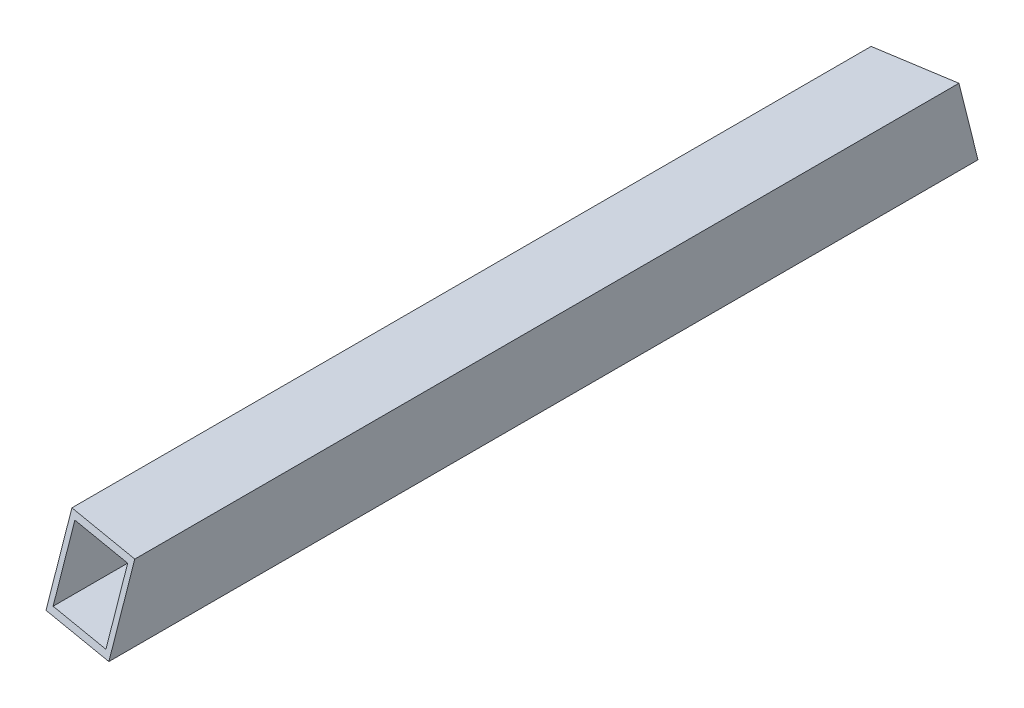
ISO-10303-21;
HEADER;
FILE_DESCRIPTION(('STEP AP214'),'2;1');
FILE_NAME('part.step','',(''),(''),'','','');
FILE_SCHEMA(('AUTOMOTIVE_DESIGN { 1 0 10303 214 1 1 1 1 }'));
ENDSEC;
DATA;
#1=APPLICATION_CONTEXT('core data for automotive mechanical design processes');
#2=APPLICATION_PROTOCOL_DEFINITION('international standard','automotive_design',2000,#1);
#3=PRODUCT_CONTEXT('',#1,'mechanical');
#4=PRODUCT('Part','Part','',(#3));
#5=PRODUCT_RELATED_PRODUCT_CATEGORY('part','',(#4));
#6=PRODUCT_DEFINITION_FORMATION('','',#4);
#7=PRODUCT_DEFINITION_CONTEXT('part definition',#1,'design');
#8=PRODUCT_DEFINITION('design','',#6,#7);
#9=PRODUCT_DEFINITION_SHAPE('','',#8);
#10=(LENGTH_UNIT() NAMED_UNIT(*) SI_UNIT(.MILLI.,.METRE.));
#11=(NAMED_UNIT(*) PLANE_ANGLE_UNIT() SI_UNIT($,.RADIAN.));
#12=(NAMED_UNIT(*) SI_UNIT($,.STERADIAN.) SOLID_ANGLE_UNIT());
#13=UNCERTAINTY_MEASURE_WITH_UNIT(LENGTH_MEASURE(1.E-05),#10,'distance_accuracy_value','');
#14=(GEOMETRIC_REPRESENTATION_CONTEXT(3) GLOBAL_UNCERTAINTY_ASSIGNED_CONTEXT((#13)) GLOBAL_UNIT_ASSIGNED_CONTEXT((#10,
#11,#12)) REPRESENTATION_CONTEXT('',''));
#15=CARTESIAN_POINT('',(0.,0.,0.));
#16=DIRECTION('',(0.,0.,1.));
#17=DIRECTION('',(1.,0.,0.));
#18=AXIS2_PLACEMENT_3D('',#15,#16,#17);
#19=CARTESIAN_POINT('',(-100.,-90.0000000000004,-550.));
#20=DIRECTION('',(0.,1.,0.));
#21=DIRECTION('',(0.,0.,1.));
#22=AXIS2_PLACEMENT_3D('',#19,#20,#21);
#23=PLANE('',#22);
#24=DIRECTION('',(-0.987732357643365,0.,0.156156298829987));
#25=VECTOR('',#24,1.);
#26=CARTESIAN_POINT('',(-134.564726157136,-90.0000000000004,-768.631580757786));
#27=LINE('',#26,#25);
#28=CARTESIAN_POINT('',(-100.,-90.0000000000004,-774.096117446295));
#29=VERTEX_POINT('',#28);
#30=CARTESIAN_POINT('',(-120.,-90.0000000000004,-770.934202224594));
#31=VERTEX_POINT('',#30);
#32=EDGE_CURVE('E118',#29,#31,#27,.T.);
#33=ORIENTED_EDGE('',*,*,#32,.F.);
#34=DIRECTION('',(0.,0.,-1.));
#35=VECTOR('',#34,1.);
#36=CARTESIAN_POINT('',(-100.,-90.0000000000004,-550.));
#37=LINE('',#36,#35);
#38=CARTESIAN_POINT('',(-100.,-90.0000000000004,-544.875388202502));
#39=VERTEX_POINT('',#38);
#40=EDGE_CURVE('E55',#39,#29,#37,.T.);
#41=ORIENTED_EDGE('',*,*,#40,.F.);
#42=DIRECTION('',(0.985721919281302,0.,0.168381405886715));
#43=VECTOR('',#42,1.);
#44=CARTESIAN_POINT('',(-100.850568935452,-90.0000000000004,-545.020682722542));
#45=LINE('',#44,#43);
#46=CARTESIAN_POINT('',(-120.,-90.0000000000005,-548.291796067501));
#47=VERTEX_POINT('',#46);
#48=EDGE_CURVE('E130',#47,#39,#45,.T.);
#49=ORIENTED_EDGE('',*,*,#48,.F.);
#50=DIRECTION('',(0.,0.,-1.));
#51=VECTOR('',#50,1.);
#52=CARTESIAN_POINT('',(-120.,-90.0000000000004,-550.));
#53=LINE('',#52,#51);
#54=EDGE_CURVE('E137',#47,#31,#53,.T.);
#55=ORIENTED_EDGE('',*,*,#54,.T.);
#56=EDGE_LOOP('',(#33,#41,#49,#55));
#57=FACE_BOUND('',#56,.T.);
#58=ADVANCED_FACE('F41',(#57),#23,.F.);
#59=CARTESIAN_POINT('',(-100.,-90.0000000000004,-550.));
#60=DIRECTION('',(-1.,0.,0.));
#61=DIRECTION('',(0.,0.,1.));
#62=AXIS2_PLACEMENT_3D('',#59,#60,#61);
#63=PLANE('',#62);
#64=DIRECTION('',(0.,-0.969795585317005,-0.243919090478065));
#65=VECTOR('',#64,1.);
#66=CARTESIAN_POINT('',(-100.,-36.9896920638836,-760.763177707749));
#67=LINE('',#66,#65);
#68=CARTESIAN_POINT('',(-100.,-70.0000000000004,-769.065797775406));
#69=VERTEX_POINT('',#68);
#70=EDGE_CURVE('E160',#69,#29,#67,.T.);
#71=ORIENTED_EDGE('',*,*,#70,.F.);
#72=DIRECTION('',(0.,0.,-1.));
#73=VECTOR('',#72,1.);
#74=CARTESIAN_POINT('',(-100.,-70.0000000000004,-550.));
#75=LINE('',#74,#73);
#76=CARTESIAN_POINT('',(-100.,-70.0000000000004,-551.708203932499));
#77=VERTEX_POINT('',#76);
#78=EDGE_CURVE('E127',#77,#69,#75,.T.);
#79=ORIENTED_EDGE('',*,*,#78,.F.);
#80=DIRECTION('',(0.,0.94629851540018,-0.32329416906498));
#81=VECTOR('',#80,1.);
#82=CARTESIAN_POINT('',(-100.,-88.4322132037293,-545.411008116644));
#83=LINE('',#82,#81);
#84=EDGE_CURVE('E175',#39,#77,#83,.T.);
#85=ORIENTED_EDGE('',*,*,#84,.F.);
#86=ORIENTED_EDGE('',*,*,#40,.T.);
#87=EDGE_LOOP('',(#71,#79,#85,#86));
#88=FACE_BOUND('',#87,.T.);
#89=ADVANCED_FACE('F183',(#88),#63,.F.);
#90=CARTESIAN_POINT('',(-100.,-70.0000000000004,-550.));
#91=DIRECTION('',(0.,-1.,0.));
#92=DIRECTION('',(0.,0.,-1.));
#93=AXIS2_PLACEMENT_3D('',#90,#91,#92);
#94=PLANE('',#93);
#95=DIRECTION('',(0.987732357643365,0.,-0.156156298829987));
#96=VECTOR('',#95,1.);
#97=CARTESIAN_POINT('',(-133.788846486,-70.0000000000004,-763.723924374015));
#98=LINE('',#97,#96);
#99=CARTESIAN_POINT('',(-120.,-70.0000000000004,-765.903882553705));
#100=VERTEX_POINT('',#99);
#101=EDGE_CURVE('E163',#100,#69,#98,.T.);
#102=ORIENTED_EDGE('',*,*,#101,.F.);
#103=DIRECTION('',(0.,0.,-1.));
#104=VECTOR('',#103,1.);
#105=CARTESIAN_POINT('',(-120.,-70.0000000000004,-550.));
#106=LINE('',#105,#104);
#107=CARTESIAN_POINT('',(-120.,-70.0000000000004,-555.124611797498));
#108=VERTEX_POINT('',#107);
#109=EDGE_CURVE('E139',#108,#100,#106,.T.);
#110=ORIENTED_EDGE('',*,*,#109,.F.);
#111=DIRECTION('',(-0.985721919281302,0.,-0.168381405886715));
#112=VECTOR('',#111,1.);
#113=CARTESIAN_POINT('',(-99.7164770215165,-70.0000000000004,-551.659772425819));
#114=LINE('',#113,#112);
#115=EDGE_CURVE('E173',#77,#108,#114,.T.);
#116=ORIENTED_EDGE('',*,*,#115,.F.);
#117=ORIENTED_EDGE('',*,*,#78,.T.);
#118=EDGE_LOOP('',(#102,#110,#116,#117));
#119=FACE_BOUND('',#118,.T.);
#120=ADVANCED_FACE('F185',(#119),#94,.F.);
#121=CARTESIAN_POINT('',(-120.,-90.0000000000004,-550.));
#122=DIRECTION('',(1.,0.,0.));
#123=DIRECTION('',(0.,0.,-1.));
#124=AXIS2_PLACEMENT_3D('',#121,#122,#123);
#125=PLANE('',#124);
#126=DIRECTION('',(0.,0.969795585317005,0.243919090478065));
#127=VECTOR('',#126,1.);
#128=CARTESIAN_POINT('',(-120.,-37.7376483492506,-757.78938544681));
#129=LINE('',#128,#127);
#130=EDGE_CURVE('E152',#31,#100,#129,.T.);
#131=ORIENTED_EDGE('',*,*,#130,.F.);
#132=ORIENTED_EDGE('',*,*,#54,.F.);
#133=DIRECTION('',(0.,-0.94629851540018,0.32329416906498));
#134=VECTOR('',#133,1.);
#135=CARTESIAN_POINT('',(-120.,-89.4774044012435,-548.470336038881));
#136=LINE('',#135,#134);
#137=EDGE_CURVE('E170',#108,#47,#136,.T.);
#138=ORIENTED_EDGE('',*,*,#137,.F.);
#139=ORIENTED_EDGE('',*,*,#109,.T.);
#140=EDGE_LOOP('',(#131,#132,#138,#139));
#141=FACE_BOUND('',#140,.T.);
#142=ADVANCED_FACE('F187',(#141),#125,.F.);
#143=CARTESIAN_POINT('',(-110.,-80.,-550.));
#144=DIRECTION('',(-0.159575689721233,0.319151379442465,0.934172358962715));
#145=DIRECTION('',(0.,-0.94629851540018,0.32329416906498));
#146=AXIS2_PLACEMENT_3D('',#143,#144,#145);
#147=PLANE('',#146);
#148=DIRECTION('',(0.,-0.94629851540018,0.32329416906498));
#149=VECTOR('',#148,1.);
#150=CARTESIAN_POINT('',(-118.4,-87.9610196970446,-548.71508227266));
#151=LINE('',#150,#149);
#152=CARTESIAN_POINT('',(-118.4,-71.6000000000004,-554.304673909898));
#153=VERTEX_POINT('',#152);
#154=CARTESIAN_POINT('',(-118.4,-88.4000000000004,-548.5651086967));
#155=VERTEX_POINT('',#154);
#156=EDGE_CURVE('E123',#153,#155,#151,.T.);
#157=ORIENTED_EDGE('',*,*,#156,.F.);
#158=DIRECTION('',(-0.985721919281302,0.,-0.168381405886715));
#159=VECTOR('',#158,1.);
#160=CARTESIAN_POINT('',(-101.361840698074,-71.6000000000004,-551.394208837688));
#161=LINE('',#160,#159);
#162=CARTESIAN_POINT('',(-101.6,-71.6000000000004,-551.434891303299));
#163=VERTEX_POINT('',#162);
#164=EDGE_CURVE('E149',#163,#153,#161,.T.);
#165=ORIENTED_EDGE('',*,*,#164,.F.);
#166=DIRECTION('',(0.,0.94629851540018,-0.32329416906498));
#167=VECTOR('',#166,1.);
#168=CARTESIAN_POINT('',(-101.6,-87.0830590911327,-546.145246817981));
#169=LINE('',#168,#167);
#170=CARTESIAN_POINT('',(-101.6,-88.4000000000004,-545.695326090102));
#171=VERTEX_POINT('',#170);
#172=EDGE_CURVE('E147',#171,#163,#169,.T.);
#173=ORIENTED_EDGE('',*,*,#172,.F.);
#174=DIRECTION('',(0.985721919281302,0.,0.168381405886714));
#175=VECTOR('',#174,1.);
#176=CARTESIAN_POINT('',(-102.31447790578,-88.4000000000004,-545.817373486935));
#177=LINE('',#176,#175);
#178=EDGE_CURVE('E48',#155,#171,#177,.T.);
#179=ORIENTED_EDGE('',*,*,#178,.F.);
#180=EDGE_LOOP('',(#157,#165,#173,#179));
#181=FACE_BOUND('',#180,.T.);
#182=ORIENTED_EDGE('',*,*,#137,.T.);
#183=ORIENTED_EDGE('',*,*,#48,.T.);
#184=ORIENTED_EDGE('',*,*,#84,.T.);
#185=ORIENTED_EDGE('',*,*,#115,.T.);
#186=EDGE_LOOP('',(#182,#183,#184,#185));
#187=FACE_BOUND('',#186,.T.);
#188=ADVANCED_FACE('F144',(#181,#187),#147,.T.);
#189=CARTESIAN_POINT('',(-118.4,-88.4000000000004,-550.));
#190=DIRECTION('',(1.,0.,0.));
#191=DIRECTION('',(0.,0.,-1.));
#192=AXIS2_PLACEMENT_3D('',#189,#190,#191);
#193=PLANE('',#192);
#194=DIRECTION('',(0.,0.,-1.));
#195=VECTOR('',#194,1.);
#196=CARTESIAN_POINT('',(-118.4,-88.4000000000004,-550.));
#197=LINE('',#196,#195);
#198=CARTESIAN_POINT('',(-118.4,-88.4000000000004,-770.784729868659));
#199=VERTEX_POINT('',#198);
#200=EDGE_CURVE('E114',#155,#199,#197,.T.);
#201=ORIENTED_EDGE('',*,*,#200,.T.);
#202=DIRECTION('',(0.,0.969795585317005,0.243919090478065));
#203=VECTOR('',#202,1.);
#204=CARTESIAN_POINT('',(-118.4,-36.1730062827407,-757.648806176293));
#205=LINE('',#204,#203);
#206=CARTESIAN_POINT('',(-118.4,-71.6000000000004,-766.559261345112));
#207=VERTEX_POINT('',#206);
#208=EDGE_CURVE('E11',#199,#207,#205,.T.);
#209=ORIENTED_EDGE('',*,*,#208,.T.);
#210=DIRECTION('',(0.,0.,-1.));
#211=VECTOR('',#210,1.);
#212=CARTESIAN_POINT('',(-118.4,-71.6000000000004,-550.));
#213=LINE('',#212,#211);
#214=EDGE_CURVE('E135',#153,#207,#213,.T.);
#215=ORIENTED_EDGE('',*,*,#214,.F.);
#216=ORIENTED_EDGE('',*,*,#156,.T.);
#217=EDGE_LOOP('',(#201,#209,#215,#216));
#218=FACE_BOUND('',#217,.T.);
#219=ADVANCED_FACE('F122',(#218),#193,.T.);
#220=CARTESIAN_POINT('',(-101.6,-71.6000000000004,-550.));
#221=DIRECTION('',(0.,-1.,0.));
#222=DIRECTION('',(0.,0.,-1.));
#223=AXIS2_PLACEMENT_3D('',#220,#221,#222);
#224=PLANE('',#223);
#225=ORIENTED_EDGE('',*,*,#214,.T.);
#226=DIRECTION('',(0.987732357643365,0.,-0.156156298829987));
#227=VECTOR('',#226,1.);
#228=CARTESIAN_POINT('',(-135.411901196228,-71.6000000000004,-763.86975187799));
#229=LINE('',#228,#227);
#230=CARTESIAN_POINT('',(-101.6,-71.6000000000004,-769.215270131341));
#231=VERTEX_POINT('',#230);
#232=EDGE_CURVE('E63',#207,#231,#229,.T.);
#233=ORIENTED_EDGE('',*,*,#232,.T.);
#234=DIRECTION('',(0.,0.,-1.));
#235=VECTOR('',#234,1.);
#236=CARTESIAN_POINT('',(-101.6,-71.6000000000004,-550.));
#237=LINE('',#236,#235);
#238=EDGE_CURVE('E125',#163,#231,#237,.T.);
#239=ORIENTED_EDGE('',*,*,#238,.F.);
#240=ORIENTED_EDGE('',*,*,#164,.T.);
#241=EDGE_LOOP('',(#225,#233,#239,#240));
#242=FACE_BOUND('',#241,.T.);
#243=ADVANCED_FACE('F229',(#242),#224,.T.);
#244=CARTESIAN_POINT('',(-101.6,-88.4000000000004,-550.));
#245=DIRECTION('',(-1.,0.,0.));
#246=DIRECTION('',(0.,0.,1.));
#247=AXIS2_PLACEMENT_3D('',#244,#245,#246);
#248=PLANE('',#247);
#249=ORIENTED_EDGE('',*,*,#238,.T.);
#250=DIRECTION('',(0.,-0.969795585317005,-0.243919090478065));
#251=VECTOR('',#250,1.);
#252=CARTESIAN_POINT('',(-101.6,-35.5447230030324,-760.146791675482));
#253=LINE('',#252,#251);
#254=CARTESIAN_POINT('',(-101.6,-88.4000000000004,-773.440738654888));
#255=VERTEX_POINT('',#254);
#256=EDGE_CURVE('E119',#231,#255,#253,.T.);
#257=ORIENTED_EDGE('',*,*,#256,.T.);
#258=DIRECTION('',(0.,0.,-1.));
#259=VECTOR('',#258,1.);
#260=CARTESIAN_POINT('',(-101.6,-88.4000000000004,-550.));
#261=LINE('',#260,#259);
#262=EDGE_CURVE('E116',#171,#255,#261,.T.);
#263=ORIENTED_EDGE('',*,*,#262,.F.);
#264=ORIENTED_EDGE('',*,*,#172,.T.);
#265=EDGE_LOOP('',(#249,#257,#263,#264));
#266=FACE_BOUND('',#265,.T.);
#267=ADVANCED_FACE('F154',(#266),#248,.T.);
#268=CARTESIAN_POINT('',(-101.6,-88.4000000000004,-550.));
#269=DIRECTION('',(0.,1.,0.));
#270=DIRECTION('',(-1.,0.,0.));
#271=AXIS2_PLACEMENT_3D('',#268,#269,#270);
#272=PLANE('',#271);
#273=ORIENTED_EDGE('',*,*,#262,.T.);
#274=DIRECTION('',(-0.987732357643365,0.,0.156156298829986));
#275=VECTOR('',#274,1.);
#276=CARTESIAN_POINT('',(-136.063640119983,-88.4000000000004,-767.992183240357));
#277=LINE('',#276,#275);
#278=EDGE_CURVE('E105',#255,#199,#277,.T.);
#279=ORIENTED_EDGE('',*,*,#278,.T.);
#280=ORIENTED_EDGE('',*,*,#200,.F.);
#281=ORIENTED_EDGE('',*,*,#178,.T.);
#282=EDGE_LOOP('',(#273,#279,#280,#281));
#283=FACE_BOUND('',#282,.T.);
#284=ADVANCED_FACE('F112',(#283),#272,.T.);
#285=CARTESIAN_POINT('',(-110.,-80.,-770.));
#286=DIRECTION('',(-0.151549664025948,0.241101738223099,-0.958594101358558));
#287=DIRECTION('',(0.,0.969795585317005,0.243919090478065));
#288=AXIS2_PLACEMENT_3D('',#285,#286,#287);
#289=PLANE('',#288);
#290=ORIENTED_EDGE('',*,*,#278,.F.);
#291=ORIENTED_EDGE('',*,*,#256,.F.);
#292=ORIENTED_EDGE('',*,*,#232,.F.);
#293=ORIENTED_EDGE('',*,*,#208,.F.);
#294=EDGE_LOOP('',(#290,#291,#292,#293));
#295=FACE_BOUND('',#294,.T.);
#296=ORIENTED_EDGE('',*,*,#32,.T.);
#297=ORIENTED_EDGE('',*,*,#130,.T.);
#298=ORIENTED_EDGE('',*,*,#101,.T.);
#299=ORIENTED_EDGE('',*,*,#70,.T.);
#300=EDGE_LOOP('',(#296,#297,#298,#299));
#301=FACE_BOUND('',#300,.T.);
#302=ADVANCED_FACE('F103',(#295,#301),#289,.T.);
#303=CLOSED_SHELL('',(#58,#89,#120,#142,#188,#219,#243,#267,#284,#302));
#304=MANIFOLD_SOLID_BREP('B2',#303);
#305=ADVANCED_BREP_SHAPE_REPRESENTATION('',(#18,#304),#14);
#306=SHAPE_DEFINITION_REPRESENTATION(#9,#305);
ENDSEC;
END-ISO-10303-21;
